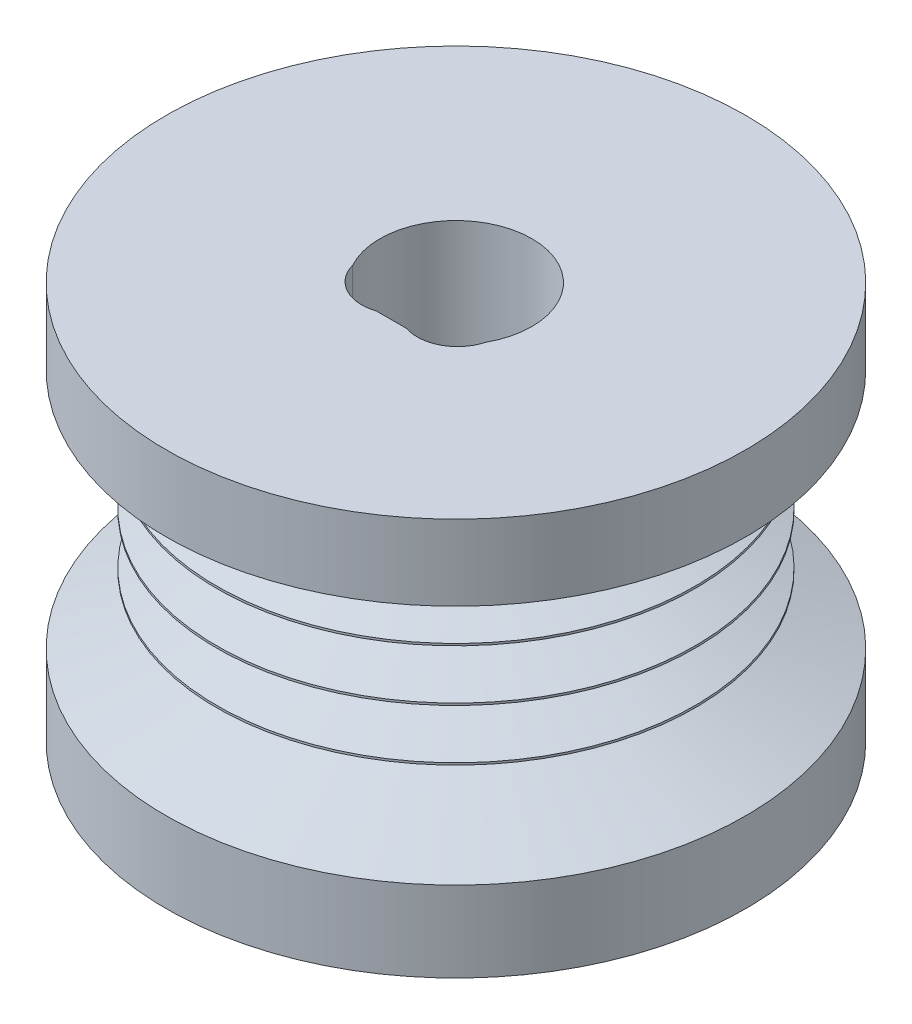
ISO-10303-21;
HEADER;
FILE_DESCRIPTION(('STEP AP214'),'2;1');
FILE_NAME('part.step','',(''),(''),'','','');
FILE_SCHEMA(('AUTOMOTIVE_DESIGN { 1 0 10303 214 1 1 1 1 }'));
ENDSEC;
DATA;
#1=APPLICATION_CONTEXT('core data for automotive mechanical design processes');
#2=APPLICATION_PROTOCOL_DEFINITION('international standard','automotive_design',2000,#1);
#3=PRODUCT_CONTEXT('',#1,'mechanical');
#4=PRODUCT('Part','Part','',(#3));
#5=PRODUCT_RELATED_PRODUCT_CATEGORY('part','',(#4));
#6=PRODUCT_DEFINITION_FORMATION('','',#4);
#7=PRODUCT_DEFINITION_CONTEXT('part definition',#1,'design');
#8=PRODUCT_DEFINITION('design','',#6,#7);
#9=PRODUCT_DEFINITION_SHAPE('','',#8);
#10=(LENGTH_UNIT() NAMED_UNIT(*) SI_UNIT(.MILLI.,.METRE.));
#11=(NAMED_UNIT(*) PLANE_ANGLE_UNIT() SI_UNIT($,.RADIAN.));
#12=(NAMED_UNIT(*) SI_UNIT($,.STERADIAN.) SOLID_ANGLE_UNIT());
#13=UNCERTAINTY_MEASURE_WITH_UNIT(LENGTH_MEASURE(1.E-05),#10,'distance_accuracy_value','');
#14=(GEOMETRIC_REPRESENTATION_CONTEXT(3) GLOBAL_UNCERTAINTY_ASSIGNED_CONTEXT((#13)) GLOBAL_UNIT_ASSIGNED_CONTEXT((#10,
#11,#12)) REPRESENTATION_CONTEXT('',''));
#15=CARTESIAN_POINT('',(0.,0.,0.));
#16=DIRECTION('',(0.,0.,1.));
#17=DIRECTION('',(1.,0.,0.));
#18=AXIS2_PLACEMENT_3D('',#15,#16,#17);
#19=CARTESIAN_POINT('',(0.,11.1125,0.));
#20=DIRECTION('',(0.,-1.,0.));
#21=DIRECTION('',(0.,0.,-1.));
#22=AXIS2_PLACEMENT_3D('',#19,#20,#21);
#23=CYLINDRICAL_SURFACE('',#22,11.43);
#24=CARTESIAN_POINT('',(0.,3.175,0.));
#25=DIRECTION('',(0.,-1.,0.));
#26=DIRECTION('',(0.,0.,-1.));
#27=AXIS2_PLACEMENT_3D('',#24,#25,#26);
#28=CIRCLE('',#27,11.43);
#29=CARTESIAN_POINT('',(0.,3.175,-11.43));
#30=VERTEX_POINT('',#29);
#31=EDGE_CURVE('E10',#30,#30,#28,.T.);
#32=ORIENTED_EDGE('',*,*,#31,.T.);
#33=EDGE_LOOP('',(#32));
#34=FACE_BOUND('',#33,.T.);
#35=CARTESIAN_POINT('',(0.,0.,0.));
#36=DIRECTION('',(0.,-1.,0.));
#37=DIRECTION('',(0.,0.,-1.));
#38=AXIS2_PLACEMENT_3D('',#35,#36,#37);
#39=CIRCLE('',#38,11.43);
#40=CARTESIAN_POINT('',(0.,0.,-11.43));
#41=VERTEX_POINT('',#40);
#42=EDGE_CURVE('E23',#41,#41,#39,.T.);
#43=ORIENTED_EDGE('',*,*,#42,.F.);
#44=EDGE_LOOP('',(#43));
#45=FACE_BOUND('',#44,.T.);
#46=ADVANCED_FACE('F16',(#34,#45),#23,.T.);
#47=CARTESIAN_POINT('',(0.,0.,9.24));
#48=DIRECTION('',(0.,-1.,0.));
#49=DIRECTION('',(0.,0.,-1.));
#50=AXIS2_PLACEMENT_3D('',#47,#48,#49);
#51=PLANE('',#50);
#52=ORIENTED_EDGE('',*,*,#42,.T.);
#53=EDGE_LOOP('',(#52));
#54=FACE_BOUND('',#53,.T.);
#55=CARTESIAN_POINT('',(0.,0.,0.));
#56=DIRECTION('',(0.,-1.,0.));
#57=DIRECTION('',(0.,0.,-1.));
#58=AXIS2_PLACEMENT_3D('',#55,#56,#57);
#59=CIRCLE('',#58,7.05);
#60=CARTESIAN_POINT('',(0.,0.,-7.05));
#61=VERTEX_POINT('',#60);
#62=EDGE_CURVE('E142',#61,#61,#59,.T.);
#63=ORIENTED_EDGE('',*,*,#62,.F.);
#64=EDGE_LOOP('',(#63));
#65=FACE_BOUND('',#64,.T.);
#66=ADVANCED_FACE('F147',(#54,#65),#51,.T.);
#67=CARTESIAN_POINT('',(0.,11.1125,0.));
#68=DIRECTION('',(0.,-1.,0.));
#69=DIRECTION('',(0.,0.,-1.));
#70=AXIS2_PLACEMENT_3D('',#67,#68,#69);
#71=CYLINDRICAL_SURFACE('',#70,7.05);
#72=ORIENTED_EDGE('',*,*,#62,.T.);
#73=EDGE_LOOP('',(#72));
#74=FACE_BOUND('',#73,.T.);
#75=CARTESIAN_POINT('',(0.,2.,0.));
#76=DIRECTION('',(0.,-1.,0.));
#77=DIRECTION('',(0.,0.,-1.));
#78=AXIS2_PLACEMENT_3D('',#75,#76,#77);
#79=CIRCLE('',#78,7.05);
#80=CARTESIAN_POINT('',(0.,2.,-7.05));
#81=VERTEX_POINT('',#80);
#82=EDGE_CURVE('E139',#81,#81,#79,.T.);
#83=ORIENTED_EDGE('',*,*,#82,.F.);
#84=EDGE_LOOP('',(#83));
#85=FACE_BOUND('',#84,.T.);
#86=ADVANCED_FACE('F156',(#74,#85),#71,.F.);
#87=CARTESIAN_POINT('',(0.,2.,5.025));
#88=DIRECTION('',(0.,-1.,0.));
#89=DIRECTION('',(0.,0.,-1.));
#90=AXIS2_PLACEMENT_3D('',#87,#88,#89);
#91=PLANE('',#90);
#92=CARTESIAN_POINT('',(1.09637088422459,2.,1.03329623017661));
#93=DIRECTION('',(0.,-1.,0.));
#94=DIRECTION('',(0.,0.,-1.));
#95=AXIS2_PLACEMENT_3D('',#92,#93,#94);
#96=CIRCLE('',#95,1.5875);
#97=CARTESIAN_POINT('',(2.63002487020132,2.,1.44324952178149));
#98=VERTEX_POINT('',#97);
#99=CARTESIAN_POINT('',(0.59637088422459,2.,2.54));
#100=VERTEX_POINT('',#99);
#101=EDGE_CURVE('E30',#98,#100,#96,.T.);
#102=ORIENTED_EDGE('',*,*,#101,.F.);
#103=CARTESIAN_POINT('',(0.,2.,0.));
#104=DIRECTION('',(0.,-1.,0.));
#105=DIRECTION('',(0.,0.,-1.));
#106=AXIS2_PLACEMENT_3D('',#103,#104,#105);
#107=CIRCLE('',#106,3.);
#108=CARTESIAN_POINT('',(-2.63002487020132,2.,1.44324952178149));
#109=VERTEX_POINT('',#108);
#110=EDGE_CURVE('E35',#109,#98,#107,.T.);
#111=ORIENTED_EDGE('',*,*,#110,.F.);
#112=CARTESIAN_POINT('',(-1.09637088422459,2.,1.03329623017662));
#113=DIRECTION('',(0.,-1.,0.));
#114=DIRECTION('',(0.,0.,-1.));
#115=AXIS2_PLACEMENT_3D('',#112,#113,#114);
#116=CIRCLE('',#115,1.5875);
#117=CARTESIAN_POINT('',(-0.596370884224589,2.,2.54));
#118=VERTEX_POINT('',#117);
#119=EDGE_CURVE('E135',#109,#118,#116,.F.);
#120=ORIENTED_EDGE('',*,*,#119,.T.);
#121=DIRECTION('',(-1.,0.,0.));
#122=VECTOR('',#121,1.);
#123=CARTESIAN_POINT('',(0.,2.,2.54));
#124=LINE('',#123,#122);
#125=EDGE_CURVE('E73',#100,#118,#124,.T.);
#126=ORIENTED_EDGE('',*,*,#125,.F.);
#127=EDGE_LOOP('',(#102,#111,#120,#126));
#128=FACE_BOUND('',#127,.T.);
#129=ORIENTED_EDGE('',*,*,#82,.T.);
#130=EDGE_LOOP('',(#129));
#131=FACE_BOUND('',#130,.T.);
#132=ADVANCED_FACE('F232',(#128,#131),#91,.T.);
#133=CARTESIAN_POINT('',(0.,15.675,1.5));
#134=DIRECTION('',(0.,1.,0.));
#135=DIRECTION('',(0.,0.,1.));
#136=AXIS2_PLACEMENT_3D('',#133,#134,#135);
#137=PLANE('',#136);
#138=CARTESIAN_POINT('',(1.09637088422459,15.675,1.03329623017661));
#139=DIRECTION('',(0.,1.,0.));
#140=DIRECTION('',(0.,0.,1.));
#141=AXIS2_PLACEMENT_3D('',#138,#139,#140);
#142=CIRCLE('',#141,1.5875);
#143=CARTESIAN_POINT('',(0.59637088422459,15.675,2.54));
#144=VERTEX_POINT('',#143);
#145=CARTESIAN_POINT('',(2.63002487020132,15.675,1.44324952178149));
#146=VERTEX_POINT('',#145);
#147=EDGE_CURVE('E58',#144,#146,#142,.T.);
#148=ORIENTED_EDGE('',*,*,#147,.F.);
#149=DIRECTION('',(1.,0.,0.));
#150=VECTOR('',#149,1.);
#151=CARTESIAN_POINT('',(0.,15.675,2.54));
#152=LINE('',#151,#150);
#153=CARTESIAN_POINT('',(-0.596370884224589,15.675,2.54));
#154=VERTEX_POINT('',#153);
#155=EDGE_CURVE('E74',#154,#144,#152,.T.);
#156=ORIENTED_EDGE('',*,*,#155,.F.);
#157=CARTESIAN_POINT('',(-1.09637088422459,15.675,1.03329623017662));
#158=DIRECTION('',(0.,-1.,0.));
#159=DIRECTION('',(0.,0.,1.));
#160=AXIS2_PLACEMENT_3D('',#157,#158,#159);
#161=CIRCLE('',#160,1.5875);
#162=CARTESIAN_POINT('',(-2.63002487020132,15.675,1.44324952178149));
#163=VERTEX_POINT('',#162);
#164=EDGE_CURVE('E61',#154,#163,#161,.T.);
#165=ORIENTED_EDGE('',*,*,#164,.T.);
#166=CARTESIAN_POINT('',(0.,15.675,0.));
#167=DIRECTION('',(0.,1.,0.));
#168=DIRECTION('',(0.,0.,1.));
#169=AXIS2_PLACEMENT_3D('',#166,#167,#168);
#170=CIRCLE('',#169,3.);
#171=EDGE_CURVE('E54',#146,#163,#170,.T.);
#172=ORIENTED_EDGE('',*,*,#171,.F.);
#173=EDGE_LOOP('',(#148,#156,#165,#172));
#174=FACE_BOUND('',#173,.T.);
#175=CARTESIAN_POINT('',(0.,15.675,0.));
#176=DIRECTION('',(0.,-1.,0.));
#177=DIRECTION('',(0.,0.,-1.));
#178=AXIS2_PLACEMENT_3D('',#175,#176,#177);
#179=CIRCLE('',#178,11.43);
#180=CARTESIAN_POINT('',(0.,15.675,-11.43));
#181=VERTEX_POINT('',#180);
#182=EDGE_CURVE('E65',#181,#181,#179,.T.);
#183=ORIENTED_EDGE('',*,*,#182,.F.);
#184=EDGE_LOOP('',(#183));
#185=FACE_BOUND('',#184,.T.);
#186=ADVANCED_FACE('F56',(#174,#185),#137,.T.);
#187=CARTESIAN_POINT('',(0.,11.1125,0.));
#188=DIRECTION('',(0.,-1.,0.));
#189=DIRECTION('',(0.,0.,-1.));
#190=AXIS2_PLACEMENT_3D('',#187,#188,#189);
#191=CYLINDRICAL_SURFACE('',#190,11.43);
#192=ORIENTED_EDGE('',*,*,#182,.T.);
#193=EDGE_LOOP('',(#192));
#194=FACE_BOUND('',#193,.T.);
#195=CARTESIAN_POINT('',(0.,12.7,0.));
#196=DIRECTION('',(0.,-1.,0.));
#197=DIRECTION('',(0.,0.,-1.));
#198=AXIS2_PLACEMENT_3D('',#195,#196,#197);
#199=CIRCLE('',#198,11.43);
#200=CARTESIAN_POINT('',(0.,12.7,-11.43));
#201=VERTEX_POINT('',#200);
#202=EDGE_CURVE('E126',#201,#201,#199,.T.);
#203=ORIENTED_EDGE('',*,*,#202,.F.);
#204=EDGE_LOOP('',(#203));
#205=FACE_BOUND('',#204,.T.);
#206=ADVANCED_FACE('F225',(#194,#205),#191,.T.);
#207=CARTESIAN_POINT('',(0.,11.2441190629352,0.));
#208=DIRECTION('',(0.,1.,0.));
#209=DIRECTION('',(0.,0.,1.));
#210=AXIS2_PLACEMENT_3D('',#207,#208,#209);
#211=CONICAL_SURFACE('',#210,7.43,1.22173047639603);
#212=ORIENTED_EDGE('',*,*,#202,.T.);
#213=EDGE_LOOP('',(#212));
#214=FACE_BOUND('',#213,.T.);
#215=CARTESIAN_POINT('',(0.,11.2441190629352,0.));
#216=DIRECTION('',(0.,-1.,0.));
#217=DIRECTION('',(0.,0.,-1.));
#218=AXIS2_PLACEMENT_3D('',#215,#216,#217);
#219=CIRCLE('',#218,7.43);
#220=CARTESIAN_POINT('',(0.,11.2441190629352,-7.43));
#221=VERTEX_POINT('',#220);
#222=EDGE_CURVE('E123',#221,#221,#219,.T.);
#223=ORIENTED_EDGE('',*,*,#222,.F.);
#224=EDGE_LOOP('',(#223));
#225=FACE_BOUND('',#224,.T.);
#226=ADVANCED_FACE('F221',(#214,#225),#211,.T.);
#227=CARTESIAN_POINT('',(0.,11.1125,0.));
#228=DIRECTION('',(0.,-1.,0.));
#229=DIRECTION('',(0.,0.,-1.));
#230=AXIS2_PLACEMENT_3D('',#227,#228,#229);
#231=CYLINDRICAL_SURFACE('',#230,7.43);
#232=ORIENTED_EDGE('',*,*,#222,.T.);
#233=EDGE_LOOP('',(#232));
#234=FACE_BOUND('',#233,.T.);
#235=CARTESIAN_POINT('',(0.,10.7441190629352,0.));
#236=DIRECTION('',(0.,-1.,0.));
#237=DIRECTION('',(0.,0.,-1.));
#238=AXIS2_PLACEMENT_3D('',#235,#236,#237);
#239=CIRCLE('',#238,7.43);
#240=CARTESIAN_POINT('',(0.,10.7441190629352,-7.43));
#241=VERTEX_POINT('',#240);
#242=EDGE_CURVE('E120',#241,#241,#239,.T.);
#243=ORIENTED_EDGE('',*,*,#242,.F.);
#244=EDGE_LOOP('',(#243));
#245=FACE_BOUND('',#244,.T.);
#246=ADVANCED_FACE('F217',(#234,#245),#231,.T.);
#247=CARTESIAN_POINT('',(0.,10.7441190629352,0.));
#248=DIRECTION('',(0.,-1.,0.));
#249=DIRECTION('',(0.,0.,-1.));
#250=AXIS2_PLACEMENT_3D('',#247,#248,#249);
#251=CONICAL_SURFACE('',#250,7.43,1.22173047639603);
#252=CARTESIAN_POINT('',(0.,10.0161785944028,0.));
#253=DIRECTION('',(0.,-1.,0.));
#254=DIRECTION('',(0.,0.,-1.));
#255=AXIS2_PLACEMENT_3D('',#252,#253,#254);
#256=CIRCLE('',#255,9.43);
#257=CARTESIAN_POINT('',(0.,10.0161785944028,-9.43));
#258=VERTEX_POINT('',#257);
#259=EDGE_CURVE('E117',#258,#258,#256,.T.);
#260=ORIENTED_EDGE('',*,*,#259,.F.);
#261=EDGE_LOOP('',(#260));
#262=FACE_BOUND('',#261,.T.);
#263=ORIENTED_EDGE('',*,*,#242,.T.);
#264=EDGE_LOOP('',(#263));
#265=FACE_BOUND('',#264,.T.);
#266=ADVANCED_FACE('F213',(#262,#265),#251,.T.);
#267=CARTESIAN_POINT('',(0.,11.1125,0.));
#268=DIRECTION('',(0.,-1.,0.));
#269=DIRECTION('',(0.,0.,-1.));
#270=AXIS2_PLACEMENT_3D('',#267,#268,#269);
#271=CYLINDRICAL_SURFACE('',#270,9.43);
#272=CARTESIAN_POINT('',(0.,9.93431348951084,0.));
#273=DIRECTION('',(0.,-1.,0.));
#274=DIRECTION('',(0.,0.,-1.));
#275=AXIS2_PLACEMENT_3D('',#272,#273,#274);
#276=CIRCLE('',#275,9.43);
#277=CARTESIAN_POINT('',(0.,9.93431348951084,-9.43));
#278=VERTEX_POINT('',#277);
#279=EDGE_CURVE('E114',#278,#278,#276,.T.);
#280=ORIENTED_EDGE('',*,*,#279,.F.);
#281=EDGE_LOOP('',(#280));
#282=FACE_BOUND('',#281,.T.);
#283=ORIENTED_EDGE('',*,*,#259,.T.);
#284=EDGE_LOOP('',(#283));
#285=FACE_BOUND('',#284,.T.);
#286=ADVANCED_FACE('F209',(#282,#285),#271,.T.);
#287=CARTESIAN_POINT('',(0.,9.93431348951084,0.));
#288=DIRECTION('',(0.,1.,0.));
#289=DIRECTION('',(0.,0.,1.));
#290=AXIS2_PLACEMENT_3D('',#287,#288,#289);
#291=CONICAL_SURFACE('',#290,9.43,1.22173047639603);
#292=CARTESIAN_POINT('',(0.,9.20637302097844,0.));
#293=DIRECTION('',(0.,-1.,0.));
#294=DIRECTION('',(0.,0.,-1.));
#295=AXIS2_PLACEMENT_3D('',#292,#293,#294);
#296=CIRCLE('',#295,7.43);
#297=CARTESIAN_POINT('',(0.,9.20637302097844,-7.43));
#298=VERTEX_POINT('',#297);
#299=EDGE_CURVE('E111',#298,#298,#296,.T.);
#300=ORIENTED_EDGE('',*,*,#299,.F.);
#301=EDGE_LOOP('',(#300));
#302=FACE_BOUND('',#301,.T.);
#303=ORIENTED_EDGE('',*,*,#279,.T.);
#304=EDGE_LOOP('',(#303));
#305=FACE_BOUND('',#304,.T.);
#306=ADVANCED_FACE('F205',(#302,#305),#291,.T.);
#307=CARTESIAN_POINT('',(0.,11.1125,0.));
#308=DIRECTION('',(0.,-1.,0.));
#309=DIRECTION('',(0.,0.,-1.));
#310=AXIS2_PLACEMENT_3D('',#307,#308,#309);
#311=CYLINDRICAL_SURFACE('',#310,7.43);
#312=CARTESIAN_POINT('',(0.,8.70637302097844,0.));
#313=DIRECTION('',(0.,-1.,0.));
#314=DIRECTION('',(0.,0.,-1.));
#315=AXIS2_PLACEMENT_3D('',#312,#313,#314);
#316=CIRCLE('',#315,7.43);
#317=CARTESIAN_POINT('',(0.,8.70637302097844,-7.43));
#318=VERTEX_POINT('',#317);
#319=EDGE_CURVE('E108',#318,#318,#316,.T.);
#320=ORIENTED_EDGE('',*,*,#319,.F.);
#321=EDGE_LOOP('',(#320));
#322=FACE_BOUND('',#321,.T.);
#323=ORIENTED_EDGE('',*,*,#299,.T.);
#324=EDGE_LOOP('',(#323));
#325=FACE_BOUND('',#324,.T.);
#326=ADVANCED_FACE('F201',(#322,#325),#311,.T.);
#327=CARTESIAN_POINT('',(0.,8.70637302097844,0.));
#328=DIRECTION('',(0.,-1.,0.));
#329=DIRECTION('',(0.,0.,-1.));
#330=AXIS2_PLACEMENT_3D('',#327,#328,#329);
#331=CONICAL_SURFACE('',#330,7.43,1.22173047639603);
#332=CARTESIAN_POINT('',(0.,7.97843255244603,0.));
#333=DIRECTION('',(0.,-1.,0.));
#334=DIRECTION('',(0.,0.,-1.));
#335=AXIS2_PLACEMENT_3D('',#332,#333,#334);
#336=CIRCLE('',#335,9.43);
#337=CARTESIAN_POINT('',(0.,7.97843255244603,-9.43));
#338=VERTEX_POINT('',#337);
#339=EDGE_CURVE('E105',#338,#338,#336,.T.);
#340=ORIENTED_EDGE('',*,*,#339,.F.);
#341=EDGE_LOOP('',(#340));
#342=FACE_BOUND('',#341,.T.);
#343=ORIENTED_EDGE('',*,*,#319,.T.);
#344=EDGE_LOOP('',(#343));
#345=FACE_BOUND('',#344,.T.);
#346=ADVANCED_FACE('F197',(#342,#345),#331,.T.);
#347=CARTESIAN_POINT('',(0.,11.1125,0.));
#348=DIRECTION('',(0.,-1.,0.));
#349=DIRECTION('',(0.,0.,-1.));
#350=AXIS2_PLACEMENT_3D('',#347,#348,#349);
#351=CYLINDRICAL_SURFACE('',#350,9.43);
#352=ORIENTED_EDGE('',*,*,#339,.T.);
#353=EDGE_LOOP('',(#352));
#354=FACE_BOUND('',#353,.T.);
#355=CARTESIAN_POINT('',(0.,7.89656744755398,0.));
#356=DIRECTION('',(0.,-1.,0.));
#357=DIRECTION('',(0.,0.,-1.));
#358=AXIS2_PLACEMENT_3D('',#355,#356,#357);
#359=CIRCLE('',#358,9.43);
#360=CARTESIAN_POINT('',(0.,7.89656744755398,-9.43));
#361=VERTEX_POINT('',#360);
#362=EDGE_CURVE('E102',#361,#361,#359,.T.);
#363=ORIENTED_EDGE('',*,*,#362,.F.);
#364=EDGE_LOOP('',(#363));
#365=FACE_BOUND('',#364,.T.);
#366=ADVANCED_FACE('F193',(#354,#365),#351,.T.);
#367=CARTESIAN_POINT('',(0.,7.16862697902157,0.));
#368=DIRECTION('',(0.,1.,0.));
#369=DIRECTION('',(0.,0.,1.));
#370=AXIS2_PLACEMENT_3D('',#367,#368,#369);
#371=CONICAL_SURFACE('',#370,7.43,1.22173047639603);
#372=ORIENTED_EDGE('',*,*,#362,.T.);
#373=EDGE_LOOP('',(#372));
#374=FACE_BOUND('',#373,.T.);
#375=CARTESIAN_POINT('',(0.,7.16862697902157,0.));
#376=DIRECTION('',(0.,-1.,0.));
#377=DIRECTION('',(0.,0.,-1.));
#378=AXIS2_PLACEMENT_3D('',#375,#376,#377);
#379=CIRCLE('',#378,7.43);
#380=CARTESIAN_POINT('',(0.,7.16862697902157,-7.43));
#381=VERTEX_POINT('',#380);
#382=EDGE_CURVE('E99',#381,#381,#379,.T.);
#383=ORIENTED_EDGE('',*,*,#382,.F.);
#384=EDGE_LOOP('',(#383));
#385=FACE_BOUND('',#384,.T.);
#386=ADVANCED_FACE('F189',(#374,#385),#371,.T.);
#387=CARTESIAN_POINT('',(0.,11.1125,0.));
#388=DIRECTION('',(0.,-1.,0.));
#389=DIRECTION('',(0.,0.,-1.));
#390=AXIS2_PLACEMENT_3D('',#387,#388,#389);
#391=CYLINDRICAL_SURFACE('',#390,7.43);
#392=ORIENTED_EDGE('',*,*,#382,.T.);
#393=EDGE_LOOP('',(#392));
#394=FACE_BOUND('',#393,.T.);
#395=CARTESIAN_POINT('',(0.,6.66862697902157,0.));
#396=DIRECTION('',(0.,-1.,0.));
#397=DIRECTION('',(0.,0.,-1.));
#398=AXIS2_PLACEMENT_3D('',#395,#396,#397);
#399=CIRCLE('',#398,7.43);
#400=CARTESIAN_POINT('',(0.,6.66862697902157,-7.43));
#401=VERTEX_POINT('',#400);
#402=EDGE_CURVE('E96',#401,#401,#399,.T.);
#403=ORIENTED_EDGE('',*,*,#402,.F.);
#404=EDGE_LOOP('',(#403));
#405=FACE_BOUND('',#404,.T.);
#406=ADVANCED_FACE('F185',(#394,#405),#391,.T.);
#407=CARTESIAN_POINT('',(0.,5.94068651048917,0.));
#408=DIRECTION('',(0.,-1.,0.));
#409=DIRECTION('',(0.,0.,-1.));
#410=AXIS2_PLACEMENT_3D('',#407,#408,#409);
#411=CONICAL_SURFACE('',#410,9.43,1.22173047639603);
#412=ORIENTED_EDGE('',*,*,#402,.T.);
#413=EDGE_LOOP('',(#412));
#414=FACE_BOUND('',#413,.T.);
#415=CARTESIAN_POINT('',(0.,5.94068651048917,0.));
#416=DIRECTION('',(0.,-1.,0.));
#417=DIRECTION('',(0.,0.,-1.));
#418=AXIS2_PLACEMENT_3D('',#415,#416,#417);
#419=CIRCLE('',#418,9.43);
#420=CARTESIAN_POINT('',(0.,5.94068651048917,-9.43));
#421=VERTEX_POINT('',#420);
#422=EDGE_CURVE('E93',#421,#421,#419,.T.);
#423=ORIENTED_EDGE('',*,*,#422,.F.);
#424=EDGE_LOOP('',(#423));
#425=FACE_BOUND('',#424,.T.);
#426=ADVANCED_FACE('F181',(#414,#425),#411,.T.);
#427=CARTESIAN_POINT('',(0.,11.1125,0.));
#428=DIRECTION('',(0.,-1.,0.));
#429=DIRECTION('',(0.,0.,-1.));
#430=AXIS2_PLACEMENT_3D('',#427,#428,#429);
#431=CYLINDRICAL_SURFACE('',#430,9.43);
#432=ORIENTED_EDGE('',*,*,#422,.T.);
#433=EDGE_LOOP('',(#432));
#434=FACE_BOUND('',#433,.T.);
#435=CARTESIAN_POINT('',(0.,5.85882140559719,0.));
#436=DIRECTION('',(0.,-1.,0.));
#437=DIRECTION('',(0.,0.,-1.));
#438=AXIS2_PLACEMENT_3D('',#435,#436,#437);
#439=CIRCLE('',#438,9.43);
#440=CARTESIAN_POINT('',(0.,5.85882140559719,-9.43));
#441=VERTEX_POINT('',#440);
#442=EDGE_CURVE('E90',#441,#441,#439,.T.);
#443=ORIENTED_EDGE('',*,*,#442,.F.);
#444=EDGE_LOOP('',(#443));
#445=FACE_BOUND('',#444,.T.);
#446=ADVANCED_FACE('F177',(#434,#445),#431,.T.);
#447=CARTESIAN_POINT('',(0.,5.13088093706478,0.));
#448=DIRECTION('',(0.,1.,0.));
#449=DIRECTION('',(0.,0.,1.));
#450=AXIS2_PLACEMENT_3D('',#447,#448,#449);
#451=CONICAL_SURFACE('',#450,7.43,1.22173047639603);
#452=ORIENTED_EDGE('',*,*,#442,.T.);
#453=EDGE_LOOP('',(#452));
#454=FACE_BOUND('',#453,.T.);
#455=CARTESIAN_POINT('',(0.,5.13088093706478,0.));
#456=DIRECTION('',(0.,-1.,0.));
#457=DIRECTION('',(0.,0.,-1.));
#458=AXIS2_PLACEMENT_3D('',#455,#456,#457);
#459=CIRCLE('',#458,7.43);
#460=CARTESIAN_POINT('',(0.,5.13088093706478,-7.43));
#461=VERTEX_POINT('',#460);
#462=EDGE_CURVE('E87',#461,#461,#459,.T.);
#463=ORIENTED_EDGE('',*,*,#462,.F.);
#464=EDGE_LOOP('',(#463));
#465=FACE_BOUND('',#464,.T.);
#466=ADVANCED_FACE('F170',(#454,#465),#451,.T.);
#467=CARTESIAN_POINT('',(0.,11.1125,0.));
#468=DIRECTION('',(0.,-1.,0.));
#469=DIRECTION('',(0.,0.,-1.));
#470=AXIS2_PLACEMENT_3D('',#467,#468,#469);
#471=CYLINDRICAL_SURFACE('',#470,7.43);
#472=ORIENTED_EDGE('',*,*,#462,.T.);
#473=EDGE_LOOP('',(#472));
#474=FACE_BOUND('',#473,.T.);
#475=CARTESIAN_POINT('',(0.,4.63088093706478,0.));
#476=DIRECTION('',(0.,-1.,0.));
#477=DIRECTION('',(0.,0.,-1.));
#478=AXIS2_PLACEMENT_3D('',#475,#476,#477);
#479=CIRCLE('',#478,7.43);
#480=CARTESIAN_POINT('',(0.,4.63088093706478,-7.43));
#481=VERTEX_POINT('',#480);
#482=EDGE_CURVE('E79',#481,#481,#479,.T.);
#483=ORIENTED_EDGE('',*,*,#482,.F.);
#484=EDGE_LOOP('',(#483));
#485=FACE_BOUND('',#484,.T.);
#486=ADVANCED_FACE('F161',(#474,#485),#471,.T.);
#487=CARTESIAN_POINT('',(0.,3.175,0.));
#488=DIRECTION('',(0.,-1.,0.));
#489=DIRECTION('',(0.,0.,-1.));
#490=AXIS2_PLACEMENT_3D('',#487,#488,#489);
#491=CONICAL_SURFACE('',#490,11.43,1.22173047639603);
#492=ORIENTED_EDGE('',*,*,#482,.T.);
#493=EDGE_LOOP('',(#492));
#494=FACE_BOUND('',#493,.T.);
#495=ORIENTED_EDGE('',*,*,#31,.F.);
#496=EDGE_LOOP('',(#495));
#497=FACE_BOUND('',#496,.T.);
#498=ADVANCED_FACE('F159',(#494,#497),#491,.T.);
#499=CARTESIAN_POINT('',(1.09637088422459,-9.725,1.03329623017661));
#500=DIRECTION('',(0.,1.,0.));
#501=DIRECTION('',(0.,0.,1.));
#502=AXIS2_PLACEMENT_3D('',#499,#500,#501);
#503=CYLINDRICAL_SURFACE('',#502,1.5875);
#504=ORIENTED_EDGE('',*,*,#101,.T.);
#505=DIRECTION('',(0.,1.,0.));
#506=VECTOR('',#505,1.);
#507=CARTESIAN_POINT('',(0.59637088422459,-9.725,2.54));
#508=LINE('',#507,#506);
#509=EDGE_CURVE('E71',#100,#144,#508,.T.);
#510=ORIENTED_EDGE('',*,*,#509,.T.);
#511=ORIENTED_EDGE('',*,*,#147,.T.);
#512=DIRECTION('',(0.,1.,0.));
#513=VECTOR('',#512,1.);
#514=CARTESIAN_POINT('',(2.63002487020132,-9.725,1.44324952178149));
#515=LINE('',#514,#513);
#516=EDGE_CURVE('E69',#98,#146,#515,.T.);
#517=ORIENTED_EDGE('',*,*,#516,.F.);
#518=EDGE_LOOP('',(#504,#510,#511,#517));
#519=FACE_BOUND('',#518,.T.);
#520=ADVANCED_FACE('F68',(#519),#503,.F.);
#521=CARTESIAN_POINT('',(0.,-9.725,0.));
#522=DIRECTION('',(0.,1.,0.));
#523=DIRECTION('',(0.,0.,1.));
#524=AXIS2_PLACEMENT_3D('',#521,#522,#523);
#525=CYLINDRICAL_SURFACE('',#524,3.);
#526=ORIENTED_EDGE('',*,*,#110,.T.);
#527=ORIENTED_EDGE('',*,*,#516,.T.);
#528=ORIENTED_EDGE('',*,*,#171,.T.);
#529=DIRECTION('',(0.,1.,0.));
#530=VECTOR('',#529,1.);
#531=CARTESIAN_POINT('',(-2.63002487020132,-9.725,1.44324952178149));
#532=LINE('',#531,#530);
#533=EDGE_CURVE('E77',#109,#163,#532,.T.);
#534=ORIENTED_EDGE('',*,*,#533,.F.);
#535=EDGE_LOOP('',(#526,#527,#528,#534));
#536=FACE_BOUND('',#535,.T.);
#537=ADVANCED_FACE('F76',(#536),#525,.F.);
#538=CARTESIAN_POINT('',(-1.09637088422459,-9.725,1.03329623017662));
#539=DIRECTION('',(0.,1.,0.));
#540=DIRECTION('',(0.,0.,1.));
#541=AXIS2_PLACEMENT_3D('',#538,#539,#540);
#542=CYLINDRICAL_SURFACE('',#541,1.5875);
#543=ORIENTED_EDGE('',*,*,#533,.T.);
#544=ORIENTED_EDGE('',*,*,#164,.F.);
#545=DIRECTION('',(0.,1.,0.));
#546=VECTOR('',#545,1.);
#547=CARTESIAN_POINT('',(-0.596370884224589,-9.725,2.54));
#548=LINE('',#547,#546);
#549=EDGE_CURVE('E81',#118,#154,#548,.T.);
#550=ORIENTED_EDGE('',*,*,#549,.F.);
#551=ORIENTED_EDGE('',*,*,#119,.F.);
#552=EDGE_LOOP('',(#543,#544,#550,#551));
#553=FACE_BOUND('',#552,.T.);
#554=ADVANCED_FACE('F356',(#553),#542,.F.);
#555=CARTESIAN_POINT('',(0.,-9.725,2.54));
#556=DIRECTION('',(0.,0.,1.));
#557=DIRECTION('',(1.,0.,0.));
#558=AXIS2_PLACEMENT_3D('',#555,#556,#557);
#559=PLANE('',#558);
#560=ORIENTED_EDGE('',*,*,#125,.T.);
#561=ORIENTED_EDGE('',*,*,#549,.T.);
#562=ORIENTED_EDGE('',*,*,#155,.T.);
#563=ORIENTED_EDGE('',*,*,#509,.F.);
#564=EDGE_LOOP('',(#560,#561,#562,#563));
#565=FACE_BOUND('',#564,.T.);
#566=ADVANCED_FACE('F364',(#565),#559,.F.);
#567=CLOSED_SHELL('',(#46,#66,#86,#132,#186,#206,#226,#246,#266,#286,#306,#326,#346,#366,#386,
#406,#426,#446,#466,#486,#498,#520,#537,#554,#566));
#568=MANIFOLD_SOLID_BREP('B1',#567);
#569=ADVANCED_BREP_SHAPE_REPRESENTATION('',(#18,#568),#14);
#570=SHAPE_DEFINITION_REPRESENTATION(#9,#569);
ENDSEC;
END-ISO-10303-21;
